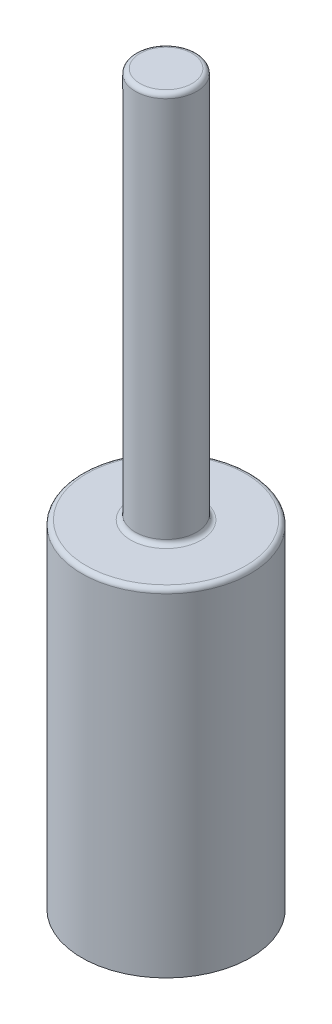
ISO-10303-21;
HEADER;
FILE_DESCRIPTION(('STEP AP214'),'2;1');
FILE_NAME('part.step','',(''),(''),'','','');
FILE_SCHEMA(('AUTOMOTIVE_DESIGN { 1 0 10303 214 1 1 1 1 }'));
ENDSEC;
DATA;
#1=APPLICATION_CONTEXT('core data for automotive mechanical design processes');
#2=APPLICATION_PROTOCOL_DEFINITION('international standard','automotive_design',2000,#1);
#3=PRODUCT_CONTEXT('',#1,'mechanical');
#4=PRODUCT('Part','Part','',(#3));
#5=PRODUCT_RELATED_PRODUCT_CATEGORY('part','',(#4));
#6=PRODUCT_DEFINITION_FORMATION('','',#4);
#7=PRODUCT_DEFINITION_CONTEXT('part definition',#1,'design');
#8=PRODUCT_DEFINITION('design','',#6,#7);
#9=PRODUCT_DEFINITION_SHAPE('','',#8);
#10=(LENGTH_UNIT() NAMED_UNIT(*) SI_UNIT(.MILLI.,.METRE.));
#11=(NAMED_UNIT(*) PLANE_ANGLE_UNIT() SI_UNIT($,.RADIAN.));
#12=(NAMED_UNIT(*) SI_UNIT($,.STERADIAN.) SOLID_ANGLE_UNIT());
#13=UNCERTAINTY_MEASURE_WITH_UNIT(LENGTH_MEASURE(1.E-05),#10,'distance_accuracy_value','');
#14=(GEOMETRIC_REPRESENTATION_CONTEXT(3) GLOBAL_UNCERTAINTY_ASSIGNED_CONTEXT((#13)) GLOBAL_UNIT_ASSIGNED_CONTEXT((#10,
#11,#12)) REPRESENTATION_CONTEXT('',''));
#15=CARTESIAN_POINT('',(0.,0.,0.));
#16=DIRECTION('',(0.,0.,1.));
#17=DIRECTION('',(1.,0.,0.));
#18=AXIS2_PLACEMENT_3D('',#15,#16,#17);
#19=CARTESIAN_POINT('',(0.,-33.5,0.));
#20=DIRECTION('',(0.,-1.,0.));
#21=DIRECTION('',(0.,0.,-1.));
#22=AXIS2_PLACEMENT_3D('',#19,#20,#21);
#23=PLANE('',#22);
#24=CARTESIAN_POINT('',(0.,-33.5,0.));
#25=DIRECTION('',(0.,-1.,0.));
#26=DIRECTION('',(0.,0.,-1.));
#27=AXIS2_PLACEMENT_3D('',#24,#25,#26);
#28=CIRCLE('',#27,4.3);
#29=CARTESIAN_POINT('',(0.,-33.5,-4.3));
#30=VERTEX_POINT('',#29);
#31=EDGE_CURVE('E62',#30,#30,#28,.T.);
#32=ORIENTED_EDGE('',*,*,#31,.T.);
#33=EDGE_LOOP('',(#32));
#34=FACE_BOUND('',#33,.T.);
#35=CARTESIAN_POINT('',(0.,-33.5,0.));
#36=DIRECTION('',(0.,-1.,0.));
#37=DIRECTION('',(0.,0.,-1.));
#38=AXIS2_PLACEMENT_3D('',#35,#36,#37);
#39=CIRCLE('',#38,2.85);
#40=CARTESIAN_POINT('',(0.,-33.5,-2.85));
#41=VERTEX_POINT('',#40);
#42=EDGE_CURVE('E116',#41,#41,#39,.T.);
#43=ORIENTED_EDGE('',*,*,#42,.F.);
#44=EDGE_LOOP('',(#43));
#45=FACE_BOUND('',#44,.T.);
#46=ADVANCED_FACE('F43',(#34,#45),#23,.T.);
#47=CARTESIAN_POINT('',(0.,-33.4,0.));
#48=DIRECTION('',(0.,-1.,0.));
#49=DIRECTION('',(0.,0.,-1.));
#50=AXIS2_PLACEMENT_3D('',#47,#48,#49);
#51=CYLINDRICAL_SURFACE('',#50,2.85);
#52=CARTESIAN_POINT('',(0.,-33.4,0.));
#53=DIRECTION('',(0.,-1.,0.));
#54=DIRECTION('',(0.,0.,-1.));
#55=AXIS2_PLACEMENT_3D('',#52,#53,#54);
#56=CIRCLE('',#55,2.85);
#57=CARTESIAN_POINT('',(0.,-33.4,-2.85));
#58=VERTEX_POINT('',#57);
#59=EDGE_CURVE('E114',#58,#58,#56,.T.);
#60=ORIENTED_EDGE('',*,*,#59,.F.);
#61=EDGE_LOOP('',(#60));
#62=FACE_BOUND('',#61,.T.);
#63=ORIENTED_EDGE('',*,*,#42,.T.);
#64=EDGE_LOOP('',(#63));
#65=FACE_BOUND('',#64,.T.);
#66=ADVANCED_FACE('F160',(#62,#65),#51,.F.);
#67=CARTESIAN_POINT('',(0.,-33.4,0.));
#68=DIRECTION('',(0.,-1.,0.));
#69=DIRECTION('',(0.,0.,-1.));
#70=AXIS2_PLACEMENT_3D('',#67,#68,#69);
#71=PLANE('',#70);
#72=CARTESIAN_POINT('',(0.,-33.4,0.));
#73=DIRECTION('',(0.,-1.,0.));
#74=DIRECTION('',(0.,0.,-1.));
#75=AXIS2_PLACEMENT_3D('',#72,#73,#74);
#76=CIRCLE('',#75,2.7);
#77=CARTESIAN_POINT('',(0.,-33.4,-2.7));
#78=VERTEX_POINT('',#77);
#79=EDGE_CURVE('E119',#78,#78,#76,.T.);
#80=ORIENTED_EDGE('',*,*,#79,.F.);
#81=EDGE_LOOP('',(#80));
#82=FACE_BOUND('',#81,.T.);
#83=ORIENTED_EDGE('',*,*,#59,.T.);
#84=EDGE_LOOP('',(#83));
#85=FACE_BOUND('',#84,.T.);
#86=ADVANCED_FACE('F165',(#82,#85),#71,.T.);
#87=CARTESIAN_POINT('',(0.,-35.5,0.));
#88=DIRECTION('',(0.,-1.,0.));
#89=DIRECTION('',(0.,0.,-1.));
#90=AXIS2_PLACEMENT_3D('',#87,#88,#89);
#91=PLANE('',#90);
#92=CARTESIAN_POINT('',(0.,-35.5,0.));
#93=DIRECTION('',(0.,-1.,0.));
#94=DIRECTION('',(0.,0.,-1.));
#95=AXIS2_PLACEMENT_3D('',#92,#93,#94);
#96=CIRCLE('',#95,1.7);
#97=CARTESIAN_POINT('',(0.,-35.5,-1.7));
#98=VERTEX_POINT('',#97);
#99=EDGE_CURVE('E100',#98,#98,#96,.T.);
#100=ORIENTED_EDGE('',*,*,#99,.T.);
#101=EDGE_LOOP('',(#100));
#102=FACE_BOUND('',#101,.T.);
#103=ADVANCED_FACE('F193',(#102),#91,.T.);
#104=CARTESIAN_POINT('',(0.,-35.2,0.));
#105=DIRECTION('',(0.,-1.,0.));
#106=DIRECTION('',(0.,0.,-1.));
#107=AXIS2_PLACEMENT_3D('',#104,#105,#106);
#108=TOROIDAL_SURFACE('',#107,1.7,0.3);
#109=CARTESIAN_POINT('',(0.,-35.2,0.));
#110=DIRECTION('',(0.,-1.,0.));
#111=DIRECTION('',(0.,0.,-1.));
#112=AXIS2_PLACEMENT_3D('',#109,#110,#111);
#113=CIRCLE('',#112,2.);
#114=CARTESIAN_POINT('',(0.,-35.2,-2.));
#115=VERTEX_POINT('',#114);
#116=EDGE_CURVE('E93',#115,#115,#113,.F.);
#117=ORIENTED_EDGE('',*,*,#116,.F.);
#118=EDGE_LOOP('',(#117));
#119=FACE_BOUND('',#118,.T.);
#120=ORIENTED_EDGE('',*,*,#99,.F.);
#121=EDGE_LOOP('',(#120));
#122=FACE_BOUND('',#121,.T.);
#123=ADVANCED_FACE('F200',(#119,#122),#108,.T.);
#124=CARTESIAN_POINT('',(0.,-11.5,0.));
#125=DIRECTION('',(0.,1.,0.));
#126=DIRECTION('',(0.,0.,1.));
#127=AXIS2_PLACEMENT_3D('',#124,#125,#126);
#128=CYLINDRICAL_SURFACE('',#127,2.);
#129=CARTESIAN_POINT('',(0.,-33.8,0.));
#130=DIRECTION('',(0.,-1.,0.));
#131=DIRECTION('',(0.,0.,-1.));
#132=AXIS2_PLACEMENT_3D('',#129,#130,#131);
#133=CIRCLE('',#132,2.);
#134=CARTESIAN_POINT('',(0.,-33.8,-2.));
#135=VERTEX_POINT('',#134);
#136=EDGE_CURVE('E86',#135,#135,#133,.T.);
#137=ORIENTED_EDGE('',*,*,#136,.T.);
#138=EDGE_LOOP('',(#137));
#139=FACE_BOUND('',#138,.T.);
#140=ORIENTED_EDGE('',*,*,#116,.T.);
#141=EDGE_LOOP('',(#140));
#142=FACE_BOUND('',#141,.T.);
#143=ADVANCED_FACE('F203',(#139,#142),#128,.T.);
#144=CARTESIAN_POINT('',(0.,-33.8,0.));
#145=DIRECTION('',(0.,-1.,0.));
#146=DIRECTION('',(0.,0.,-1.));
#147=AXIS2_PLACEMENT_3D('',#144,#145,#146);
#148=TOROIDAL_SURFACE('',#147,2.3,0.3);
#149=ORIENTED_EDGE('',*,*,#136,.F.);
#150=EDGE_LOOP('',(#149));
#151=FACE_BOUND('',#150,.T.);
#152=CARTESIAN_POINT('',(0.,-33.5,0.));
#153=DIRECTION('',(0.,-1.,0.));
#154=DIRECTION('',(0.,0.,-1.));
#155=AXIS2_PLACEMENT_3D('',#152,#153,#154);
#156=CIRCLE('',#155,2.3);
#157=CARTESIAN_POINT('',(0.,-33.5,-2.3));
#158=VERTEX_POINT('',#157);
#159=EDGE_CURVE('E92',#158,#158,#156,.F.);
#160=ORIENTED_EDGE('',*,*,#159,.F.);
#161=EDGE_LOOP('',(#160));
#162=FACE_BOUND('',#161,.T.);
#163=ADVANCED_FACE('F171',(#151,#162),#148,.F.);
#164=CARTESIAN_POINT('',(0.,-33.5,0.));
#165=DIRECTION('',(0.,-1.,0.));
#166=DIRECTION('',(0.,0.,-1.));
#167=AXIS2_PLACEMENT_3D('',#164,#165,#166);
#168=CIRCLE('',#167,2.47639320225002);
#169=CARTESIAN_POINT('',(0.,-33.5,-2.47639320225002));
#170=VERTEX_POINT('',#169);
#171=EDGE_CURVE('E66',#170,#170,#168,.T.);
#172=ORIENTED_EDGE('',*,*,#171,.T.);
#173=EDGE_LOOP('',(#172));
#174=FACE_BOUND('',#173,.T.);
#175=ORIENTED_EDGE('',*,*,#159,.T.);
#176=EDGE_LOOP('',(#175));
#177=FACE_BOUND('',#176,.T.);
#178=ADVANCED_FACE('F155',(#174,#177),#23,.T.);
#179=CARTESIAN_POINT('',(0.,-33.2,0.));
#180=DIRECTION('',(0.,1.,0.));
#181=DIRECTION('',(0.,0.,1.));
#182=AXIS2_PLACEMENT_3D('',#179,#180,#181);
#183=TOROIDAL_SURFACE('',#182,2.47639320225002,0.3);
#184=ORIENTED_EDGE('',*,*,#79,.T.);
#185=EDGE_LOOP('',(#184));
#186=FACE_BOUND('',#185,.T.);
#187=ORIENTED_EDGE('',*,*,#171,.F.);
#188=EDGE_LOOP('',(#187));
#189=FACE_BOUND('',#188,.T.);
#190=ADVANCED_FACE('F147',(#186,#189),#183,.T.);
#191=CARTESIAN_POINT('',(0.,-33.2,0.));
#192=DIRECTION('',(0.,-1.,0.));
#193=DIRECTION('',(0.,0.,-1.));
#194=AXIS2_PLACEMENT_3D('',#191,#192,#193);
#195=CYLINDRICAL_SURFACE('',#194,5.);
#196=CARTESIAN_POINT('',(0.,-33.3,0.));
#197=DIRECTION('',(0.,-1.,0.));
#198=DIRECTION('',(0.,0.,-1.));
#199=AXIS2_PLACEMENT_3D('',#196,#197,#198);
#200=CIRCLE('',#199,5.);
#201=CARTESIAN_POINT('',(0.,-33.3,-5.));
#202=VERTEX_POINT('',#201);
#203=EDGE_CURVE('E51',#202,#202,#200,.T.);
#204=ORIENTED_EDGE('',*,*,#203,.T.);
#205=EDGE_LOOP('',(#204));
#206=FACE_BOUND('',#205,.T.);
#207=CARTESIAN_POINT('',(0.,-33.2,0.));
#208=DIRECTION('',(0.,-1.,0.));
#209=DIRECTION('',(0.,0.,-1.));
#210=AXIS2_PLACEMENT_3D('',#207,#208,#209);
#211=CIRCLE('',#210,5.);
#212=CARTESIAN_POINT('',(0.,-33.2,-5.));
#213=VERTEX_POINT('',#212);
#214=EDGE_CURVE('E130',#213,#213,#211,.T.);
#215=ORIENTED_EDGE('',*,*,#214,.F.);
#216=EDGE_LOOP('',(#215));
#217=FACE_BOUND('',#216,.T.);
#218=ADVANCED_FACE('F142',(#206,#217),#195,.F.);
#219=CARTESIAN_POINT('',(0.,-33.2,0.));
#220=DIRECTION('',(0.,-1.,0.));
#221=DIRECTION('',(0.,0.,-1.));
#222=AXIS2_PLACEMENT_3D('',#219,#220,#221);
#223=PLANE('',#222);
#224=CARTESIAN_POINT('',(0.,-33.2,0.));
#225=DIRECTION('',(0.,-1.,0.));
#226=DIRECTION('',(0.,0.,-1.));
#227=AXIS2_PLACEMENT_3D('',#224,#225,#226);
#228=CIRCLE('',#227,4.5);
#229=CARTESIAN_POINT('',(0.,-33.2,-4.5));
#230=VERTEX_POINT('',#229);
#231=EDGE_CURVE('E134',#230,#230,#228,.T.);
#232=ORIENTED_EDGE('',*,*,#231,.F.);
#233=EDGE_LOOP('',(#232));
#234=FACE_BOUND('',#233,.T.);
#235=ORIENTED_EDGE('',*,*,#214,.T.);
#236=EDGE_LOOP('',(#235));
#237=FACE_BOUND('',#236,.T.);
#238=ADVANCED_FACE('F139',(#234,#237),#223,.T.);
#239=CARTESIAN_POINT('',(0.,-33.2,0.));
#240=DIRECTION('',(0.,-1.,0.));
#241=DIRECTION('',(0.,0.,-1.));
#242=AXIS2_PLACEMENT_3D('',#239,#240,#241);
#243=CYLINDRICAL_SURFACE('',#242,4.5);
#244=CARTESIAN_POINT('',(0.,-33.3,0.));
#245=DIRECTION('',(0.,-1.,0.));
#246=DIRECTION('',(0.,0.,-1.));
#247=AXIS2_PLACEMENT_3D('',#244,#245,#246);
#248=CIRCLE('',#247,4.5);
#249=CARTESIAN_POINT('',(0.,-33.3,-4.5));
#250=VERTEX_POINT('',#249);
#251=EDGE_CURVE('E57',#250,#250,#248,.F.);
#252=ORIENTED_EDGE('',*,*,#251,.T.);
#253=EDGE_LOOP('',(#252));
#254=FACE_BOUND('',#253,.T.);
#255=ORIENTED_EDGE('',*,*,#231,.T.);
#256=EDGE_LOOP('',(#255));
#257=FACE_BOUND('',#256,.T.);
#258=ADVANCED_FACE('F137',(#254,#257),#243,.T.);
#259=CARTESIAN_POINT('',(0.,14.,0.));
#260=DIRECTION('',(0.,1.,0.));
#261=DIRECTION('',(0.,0.,1.));
#262=AXIS2_PLACEMENT_3D('',#259,#260,#261);
#263=PLANE('',#262);
#264=CARTESIAN_POINT('',(0.,14.,0.));
#265=DIRECTION('',(0.,1.,0.));
#266=DIRECTION('',(0.,0.,1.));
#267=AXIS2_PLACEMENT_3D('',#264,#265,#266);
#268=CIRCLE('',#267,1.7);
#269=CARTESIAN_POINT('',(0.,14.,1.7));
#270=VERTEX_POINT('',#269);
#271=EDGE_CURVE('E110',#270,#270,#268,.T.);
#272=ORIENTED_EDGE('',*,*,#271,.T.);
#273=EDGE_LOOP('',(#272));
#274=FACE_BOUND('',#273,.T.);
#275=ADVANCED_FACE('F197',(#274),#263,.T.);
#276=CARTESIAN_POINT('',(0.,13.7,0.));
#277=DIRECTION('',(0.,1.,0.));
#278=DIRECTION('',(0.,0.,1.));
#279=AXIS2_PLACEMENT_3D('',#276,#277,#278);
#280=TOROIDAL_SURFACE('',#279,1.7,0.3);
#281=CARTESIAN_POINT('',(0.,13.7,0.));
#282=DIRECTION('',(0.,1.,0.));
#283=DIRECTION('',(0.,0.,1.));
#284=AXIS2_PLACEMENT_3D('',#281,#282,#283);
#285=CIRCLE('',#284,2.);
#286=CARTESIAN_POINT('',(0.,13.7,2.));
#287=VERTEX_POINT('',#286);
#288=EDGE_CURVE('E101',#287,#287,#285,.F.);
#289=ORIENTED_EDGE('',*,*,#288,.F.);
#290=EDGE_LOOP('',(#289));
#291=FACE_BOUND('',#290,.T.);
#292=ORIENTED_EDGE('',*,*,#271,.F.);
#293=EDGE_LOOP('',(#292));
#294=FACE_BOUND('',#293,.T.);
#295=ADVANCED_FACE('F204',(#291,#294),#280,.T.);
#296=CARTESIAN_POINT('',(0.,-11.2,0.));
#297=DIRECTION('',(0.,-1.,0.));
#298=DIRECTION('',(0.,0.,-1.));
#299=AXIS2_PLACEMENT_3D('',#296,#297,#298);
#300=CIRCLE('',#299,2.);
#301=CARTESIAN_POINT('',(0.,-11.2,-2.));
#302=VERTEX_POINT('',#301);
#303=EDGE_CURVE('E84',#302,#302,#300,.F.);
#304=ORIENTED_EDGE('',*,*,#303,.T.);
#305=EDGE_LOOP('',(#304));
#306=FACE_BOUND('',#305,.T.);
#307=ORIENTED_EDGE('',*,*,#288,.T.);
#308=EDGE_LOOP('',(#307));
#309=FACE_BOUND('',#308,.T.);
#310=ADVANCED_FACE('F209',(#306,#309),#128,.T.);
#311=CARTESIAN_POINT('',(0.,-11.2,0.));
#312=DIRECTION('',(0.,-1.,0.));
#313=DIRECTION('',(0.,0.,-1.));
#314=AXIS2_PLACEMENT_3D('',#311,#312,#313);
#315=TOROIDAL_SURFACE('',#314,2.3,0.3);
#316=CARTESIAN_POINT('',(0.,-11.5,0.));
#317=DIRECTION('',(0.,-1.,0.));
#318=DIRECTION('',(0.,0.,-1.));
#319=AXIS2_PLACEMENT_3D('',#316,#317,#318);
#320=CIRCLE('',#319,2.3);
#321=CARTESIAN_POINT('',(0.,-11.5,-2.3));
#322=VERTEX_POINT('',#321);
#323=EDGE_CURVE('E73',#322,#322,#320,.T.);
#324=ORIENTED_EDGE('',*,*,#323,.F.);
#325=EDGE_LOOP('',(#324));
#326=FACE_BOUND('',#325,.T.);
#327=ORIENTED_EDGE('',*,*,#303,.F.);
#328=EDGE_LOOP('',(#327));
#329=FACE_BOUND('',#328,.T.);
#330=ADVANCED_FACE('F218',(#326,#329),#315,.F.);
#331=CARTESIAN_POINT('',(0.,-11.5,0.));
#332=DIRECTION('',(0.,-1.,0.));
#333=DIRECTION('',(0.,0.,-1.));
#334=AXIS2_PLACEMENT_3D('',#331,#332,#333);
#335=PLANE('',#334);
#336=ORIENTED_EDGE('',*,*,#323,.T.);
#337=EDGE_LOOP('',(#336));
#338=FACE_BOUND('',#337,.T.);
#339=CARTESIAN_POINT('',(0.,-11.5,0.));
#340=DIRECTION('',(0.,-1.,0.));
#341=DIRECTION('',(0.,0.,-1.));
#342=AXIS2_PLACEMENT_3D('',#339,#340,#341);
#343=CIRCLE('',#342,5.2);
#344=CARTESIAN_POINT('',(0.,-11.5,-5.2));
#345=VERTEX_POINT('',#344);
#346=EDGE_CURVE('E79',#345,#345,#343,.F.);
#347=ORIENTED_EDGE('',*,*,#346,.T.);
#348=EDGE_LOOP('',(#347));
#349=FACE_BOUND('',#348,.T.);
#350=ADVANCED_FACE('F192',(#338,#349),#335,.F.);
#351=CARTESIAN_POINT('',(0.,-11.8,0.));
#352=DIRECTION('',(0.,-1.,0.));
#353=DIRECTION('',(0.,0.,-1.));
#354=AXIS2_PLACEMENT_3D('',#351,#352,#353);
#355=TOROIDAL_SURFACE('',#354,5.2,0.3);
#356=ORIENTED_EDGE('',*,*,#346,.F.);
#357=EDGE_LOOP('',(#356));
#358=FACE_BOUND('',#357,.T.);
#359=CARTESIAN_POINT('',(0.,-11.8,0.));
#360=DIRECTION('',(0.,-1.,0.));
#361=DIRECTION('',(0.,0.,-1.));
#362=AXIS2_PLACEMENT_3D('',#359,#360,#361);
#363=CIRCLE('',#362,5.5);
#364=CARTESIAN_POINT('',(0.,-11.8,-5.5));
#365=VERTEX_POINT('',#364);
#366=EDGE_CURVE('E72',#365,#365,#363,.T.);
#367=ORIENTED_EDGE('',*,*,#366,.F.);
#368=EDGE_LOOP('',(#367));
#369=FACE_BOUND('',#368,.T.);
#370=ADVANCED_FACE('F181',(#358,#369),#355,.T.);
#371=CARTESIAN_POINT('',(0.,-11.5,0.));
#372=DIRECTION('',(0.,-1.,0.));
#373=DIRECTION('',(0.,0.,-1.));
#374=AXIS2_PLACEMENT_3D('',#371,#372,#373);
#375=CYLINDRICAL_SURFACE('',#374,5.5);
#376=ORIENTED_EDGE('',*,*,#366,.T.);
#377=EDGE_LOOP('',(#376));
#378=FACE_BOUND('',#377,.T.);
#379=CARTESIAN_POINT('',(0.,-33.5,0.));
#380=DIRECTION('',(0.,-1.,0.));
#381=DIRECTION('',(0.,0.,-1.));
#382=AXIS2_PLACEMENT_3D('',#379,#380,#381);
#383=CIRCLE('',#382,5.5);
#384=CARTESIAN_POINT('',(0.,-33.5,-5.5));
#385=VERTEX_POINT('',#384);
#386=EDGE_CURVE('E111',#385,#385,#383,.T.);
#387=ORIENTED_EDGE('',*,*,#386,.F.);
#388=EDGE_LOOP('',(#387));
#389=FACE_BOUND('',#388,.T.);
#390=ADVANCED_FACE('F174',(#378,#389),#375,.T.);
#391=CARTESIAN_POINT('',(0.,-33.5,0.));
#392=DIRECTION('',(0.,-1.,0.));
#393=DIRECTION('',(0.,0.,-1.));
#394=AXIS2_PLACEMENT_3D('',#391,#392,#393);
#395=CIRCLE('',#394,5.2);
#396=CARTESIAN_POINT('',(0.,-33.5,-5.2));
#397=VERTEX_POINT('',#396);
#398=EDGE_CURVE('E10',#397,#397,#395,.F.);
#399=ORIENTED_EDGE('',*,*,#398,.T.);
#400=EDGE_LOOP('',(#399));
#401=FACE_BOUND('',#400,.T.);
#402=ORIENTED_EDGE('',*,*,#386,.T.);
#403=EDGE_LOOP('',(#402));
#404=FACE_BOUND('',#403,.T.);
#405=ADVANCED_FACE('F158',(#401,#404),#23,.T.);
#406=CARTESIAN_POINT('',(0.,-33.3,0.));
#407=DIRECTION('',(0.,-1.,0.));
#408=DIRECTION('',(0.,0.,-1.));
#409=AXIS2_PLACEMENT_3D('',#406,#407,#408);
#410=TOROIDAL_SURFACE('',#409,4.3,0.2);
#411=ORIENTED_EDGE('',*,*,#251,.F.);
#412=EDGE_LOOP('',(#411));
#413=FACE_BOUND('',#412,.T.);
#414=ORIENTED_EDGE('',*,*,#31,.F.);
#415=EDGE_LOOP('',(#414));
#416=FACE_BOUND('',#415,.T.);
#417=ADVANCED_FACE('F172',(#413,#416),#410,.T.);
#418=CARTESIAN_POINT('',(0.,-33.3,0.));
#419=DIRECTION('',(0.,-1.,0.));
#420=DIRECTION('',(0.,0.,-1.));
#421=AXIS2_PLACEMENT_3D('',#418,#419,#420);
#422=TOROIDAL_SURFACE('',#421,5.2,0.2);
#423=ORIENTED_EDGE('',*,*,#398,.F.);
#424=EDGE_LOOP('',(#423));
#425=FACE_BOUND('',#424,.T.);
#426=ORIENTED_EDGE('',*,*,#203,.F.);
#427=EDGE_LOOP('',(#426));
#428=FACE_BOUND('',#427,.T.);
#429=ADVANCED_FACE('F44',(#425,#428),#422,.T.);
#430=CLOSED_SHELL('',(#46,#66,#86,#103,#123,#143,#163,#178,#190,#218,#238,#258,#275,#295,#310,
#330,#350,#370,#390,#405,#417,#429));
#431=MANIFOLD_SOLID_BREP('B2',#430);
#432=ADVANCED_BREP_SHAPE_REPRESENTATION('',(#18,#431),#14);
#433=SHAPE_DEFINITION_REPRESENTATION(#9,#432);
ENDSEC;
END-ISO-10303-21;
